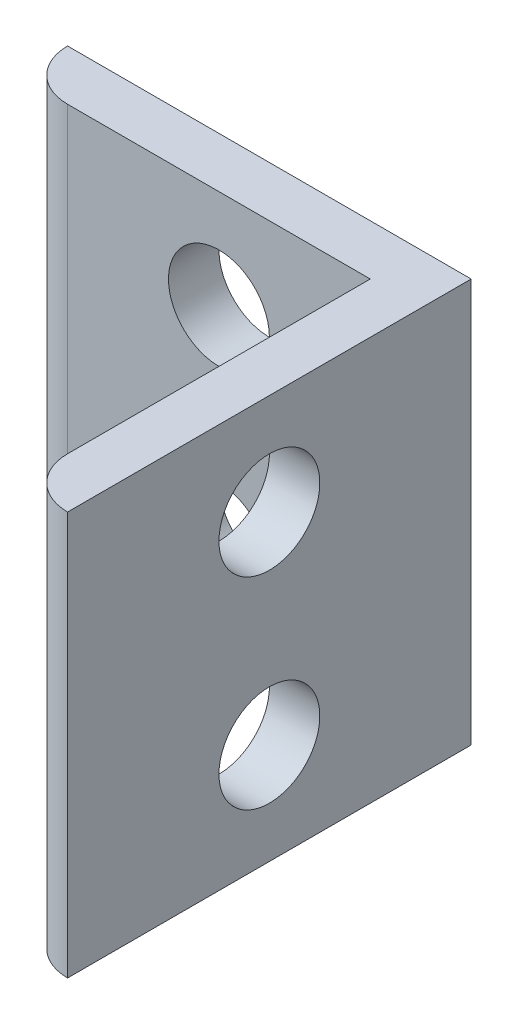
ISO-10303-21;
HEADER;
FILE_DESCRIPTION(('STEP AP214'),'2;1');
FILE_NAME('part.step','',(''),(''),'','','');
FILE_SCHEMA(('AUTOMOTIVE_DESIGN { 1 0 10303 214 1 1 1 1 }'));
ENDSEC;
DATA;
#1=APPLICATION_CONTEXT('core data for automotive mechanical design processes');
#2=APPLICATION_PROTOCOL_DEFINITION('international standard','automotive_design',2000,#1);
#3=PRODUCT_CONTEXT('',#1,'mechanical');
#4=PRODUCT('Part','Part','',(#3));
#5=PRODUCT_RELATED_PRODUCT_CATEGORY('part','',(#4));
#6=PRODUCT_DEFINITION_FORMATION('','',#4);
#7=PRODUCT_DEFINITION_CONTEXT('part definition',#1,'design');
#8=PRODUCT_DEFINITION('design','',#6,#7);
#9=PRODUCT_DEFINITION_SHAPE('','',#8);
#10=(LENGTH_UNIT() NAMED_UNIT(*) SI_UNIT(.MILLI.,.METRE.));
#11=(NAMED_UNIT(*) PLANE_ANGLE_UNIT() SI_UNIT($,.RADIAN.));
#12=(NAMED_UNIT(*) SI_UNIT($,.STERADIAN.) SOLID_ANGLE_UNIT());
#13=UNCERTAINTY_MEASURE_WITH_UNIT(LENGTH_MEASURE(1.E-05),#10,'distance_accuracy_value','');
#14=(GEOMETRIC_REPRESENTATION_CONTEXT(3) GLOBAL_UNCERTAINTY_ASSIGNED_CONTEXT((#13)) GLOBAL_UNIT_ASSIGNED_CONTEXT((#10,
#11,#12)) REPRESENTATION_CONTEXT('',''));
#15=CARTESIAN_POINT('',(0.,0.,0.));
#16=DIRECTION('',(0.,0.,1.));
#17=DIRECTION('',(1.,0.,0.));
#18=AXIS2_PLACEMENT_3D('',#15,#16,#17);
#19=CARTESIAN_POINT('',(3.175,25.4,3.175));
#20=DIRECTION('',(0.,0.,-1.));
#21=DIRECTION('',(-1.,0.,0.));
#22=AXIS2_PLACEMENT_3D('',#19,#20,#21);
#23=PLANE('',#22);
#24=CARTESIAN_POINT('',(12.7,6.35,3.175));
#25=DIRECTION('',(0.,0.,1.));
#26=DIRECTION('',(1.,0.,0.));
#27=AXIS2_PLACEMENT_3D('',#24,#25,#26);
#28=CIRCLE('',#27,3.17499999999999);
#29=CARTESIAN_POINT('',(15.875,6.35,3.175));
#30=VERTEX_POINT('',#29);
#31=EDGE_CURVE('E261',#30,#30,#28,.T.);
#32=ORIENTED_EDGE('',*,*,#31,.F.);
#33=EDGE_LOOP('',(#32));
#34=FACE_BOUND('',#33,.T.);
#35=DIRECTION('',(1.,0.,0.));
#36=VECTOR('',#35,1.);
#37=CARTESIAN_POINT('',(3.175,0.,3.175));
#38=LINE('',#37,#36);
#39=CARTESIAN_POINT('',(3.175,0.,3.175));
#40=VERTEX_POINT('',#39);
#41=CARTESIAN_POINT('',(22.225,0.,3.175));
#42=VERTEX_POINT('',#41);
#43=EDGE_CURVE('E121',#40,#42,#38,.T.);
#44=ORIENTED_EDGE('',*,*,#43,.T.);
#45=DIRECTION('',(0.,-1.,0.));
#46=VECTOR('',#45,1.);
#47=CARTESIAN_POINT('',(22.225,25.4,3.175));
#48=LINE('',#47,#46);
#49=CARTESIAN_POINT('',(22.225,25.4,3.175));
#50=VERTEX_POINT('',#49);
#51=EDGE_CURVE('E42',#50,#42,#48,.T.);
#52=ORIENTED_EDGE('',*,*,#51,.F.);
#53=DIRECTION('',(1.,0.,0.));
#54=VECTOR('',#53,1.);
#55=CARTESIAN_POINT('',(3.175,25.4,3.175));
#56=LINE('',#55,#54);
#57=CARTESIAN_POINT('',(3.175,25.4,3.175));
#58=VERTEX_POINT('',#57);
#59=EDGE_CURVE('E87',#58,#50,#56,.T.);
#60=ORIENTED_EDGE('',*,*,#59,.F.);
#61=DIRECTION('',(0.,-1.,0.));
#62=VECTOR('',#61,1.);
#63=CARTESIAN_POINT('',(3.175,25.4,3.175));
#64=LINE('',#63,#62);
#65=EDGE_CURVE('E11',#58,#40,#64,.T.);
#66=ORIENTED_EDGE('',*,*,#65,.T.);
#67=EDGE_LOOP('',(#44,#52,#60,#66));
#68=FACE_BOUND('',#67,.T.);
#69=CARTESIAN_POINT('',(12.7,19.05,3.175));
#70=DIRECTION('',(0.,0.,1.));
#71=DIRECTION('',(1.,0.,0.));
#72=AXIS2_PLACEMENT_3D('',#69,#70,#71);
#73=CIRCLE('',#72,3.17499999999999);
#74=CARTESIAN_POINT('',(15.875,19.05,3.175));
#75=VERTEX_POINT('',#74);
#76=EDGE_CURVE('E258',#75,#75,#73,.T.);
#77=ORIENTED_EDGE('',*,*,#76,.F.);
#78=EDGE_LOOP('',(#77));
#79=FACE_BOUND('',#78,.T.);
#80=ADVANCED_FACE('F33',(#34,#68,#79),#23,.F.);
#81=CARTESIAN_POINT('',(22.225,25.4,3.175));
#82=DIRECTION('',(1.,0.,0.));
#83=DIRECTION('',(0.,0.,-1.));
#84=AXIS2_PLACEMENT_3D('',#81,#82,#83);
#85=PLANE('',#84);
#86=CARTESIAN_POINT('',(22.225,6.35,12.7));
#87=DIRECTION('',(-1.,0.,0.));
#88=DIRECTION('',(0.,0.,1.));
#89=AXIS2_PLACEMENT_3D('',#86,#87,#88);
#90=CIRCLE('',#89,3.17499999999999);
#91=CARTESIAN_POINT('',(22.225,6.35,15.875));
#92=VERTEX_POINT('',#91);
#93=EDGE_CURVE('E275',#92,#92,#90,.T.);
#94=ORIENTED_EDGE('',*,*,#93,.F.);
#95=EDGE_LOOP('',(#94));
#96=FACE_BOUND('',#95,.T.);
#97=DIRECTION('',(0.,0.,1.));
#98=VECTOR('',#97,1.);
#99=CARTESIAN_POINT('',(22.225,0.,3.175));
#100=LINE('',#99,#98);
#101=CARTESIAN_POINT('',(22.225,0.,22.225));
#102=VERTEX_POINT('',#101);
#103=EDGE_CURVE('E124',#42,#102,#100,.T.);
#104=ORIENTED_EDGE('',*,*,#103,.T.);
#105=DIRECTION('',(0.,-1.,0.));
#106=VECTOR('',#105,1.);
#107=CARTESIAN_POINT('',(22.225,25.4,22.225));
#108=LINE('',#107,#106);
#109=CARTESIAN_POINT('',(22.225,25.4,22.225));
#110=VERTEX_POINT('',#109);
#111=EDGE_CURVE('E109',#110,#102,#108,.T.);
#112=ORIENTED_EDGE('',*,*,#111,.F.);
#113=DIRECTION('',(0.,0.,1.));
#114=VECTOR('',#113,1.);
#115=CARTESIAN_POINT('',(22.225,25.4,3.175));
#116=LINE('',#115,#114);
#117=EDGE_CURVE('E100',#50,#110,#116,.T.);
#118=ORIENTED_EDGE('',*,*,#117,.F.);
#119=ORIENTED_EDGE('',*,*,#51,.T.);
#120=EDGE_LOOP('',(#104,#112,#118,#119));
#121=FACE_BOUND('',#120,.T.);
#122=CARTESIAN_POINT('',(22.225,19.05,12.7));
#123=DIRECTION('',(-1.,0.,0.));
#124=DIRECTION('',(0.,0.,1.));
#125=AXIS2_PLACEMENT_3D('',#122,#123,#124);
#126=CIRCLE('',#125,3.17499999999999);
#127=CARTESIAN_POINT('',(22.225,19.05,15.875));
#128=VERTEX_POINT('',#127);
#129=EDGE_CURVE('E269',#128,#128,#126,.T.);
#130=ORIENTED_EDGE('',*,*,#129,.F.);
#131=EDGE_LOOP('',(#130));
#132=FACE_BOUND('',#131,.T.);
#133=ADVANCED_FACE('F135',(#96,#121,#132),#85,.F.);
#134=CARTESIAN_POINT('',(3.175,25.4,0.));
#135=DIRECTION('',(0.,-1.,0.));
#136=DIRECTION('',(0.,0.,-1.));
#137=AXIS2_PLACEMENT_3D('',#134,#135,#136);
#138=CYLINDRICAL_SURFACE('',#137,3.175);
#139=CARTESIAN_POINT('',(3.175,0.,0.));
#140=DIRECTION('',(0.,1.,0.));
#141=DIRECTION('',(0.,0.,1.));
#142=AXIS2_PLACEMENT_3D('',#139,#140,#141);
#143=CIRCLE('',#142,3.175);
#144=CARTESIAN_POINT('',(0.,0.,0.));
#145=VERTEX_POINT('',#144);
#146=EDGE_CURVE('E118',#145,#40,#143,.T.);
#147=ORIENTED_EDGE('',*,*,#146,.T.);
#148=ORIENTED_EDGE('',*,*,#65,.F.);
#149=CARTESIAN_POINT('',(3.175,25.4,0.));
#150=DIRECTION('',(0.,1.,0.));
#151=DIRECTION('',(0.,0.,1.));
#152=AXIS2_PLACEMENT_3D('',#149,#150,#151);
#153=CIRCLE('',#152,3.175);
#154=CARTESIAN_POINT('',(0.,25.4,0.));
#155=VERTEX_POINT('',#154);
#156=EDGE_CURVE('E129',#155,#58,#153,.T.);
#157=ORIENTED_EDGE('',*,*,#156,.F.);
#158=DIRECTION('',(0.,-1.,0.));
#159=VECTOR('',#158,1.);
#160=CARTESIAN_POINT('',(0.,25.4,0.));
#161=LINE('',#160,#159);
#162=EDGE_CURVE('E114',#155,#145,#161,.T.);
#163=ORIENTED_EDGE('',*,*,#162,.T.);
#164=EDGE_LOOP('',(#147,#148,#157,#163));
#165=FACE_BOUND('',#164,.T.);
#166=ADVANCED_FACE('F35',(#165),#138,.T.);
#167=CARTESIAN_POINT('',(25.4,25.4,22.225));
#168=DIRECTION('',(0.,-1.,0.));
#169=DIRECTION('',(0.,0.,-1.));
#170=AXIS2_PLACEMENT_3D('',#167,#168,#169);
#171=CYLINDRICAL_SURFACE('',#170,3.175);
#172=CARTESIAN_POINT('',(25.4,0.,22.225));
#173=DIRECTION('',(0.,1.,0.));
#174=DIRECTION('',(0.,0.,-1.));
#175=AXIS2_PLACEMENT_3D('',#172,#173,#174);
#176=CIRCLE('',#175,3.175);
#177=CARTESIAN_POINT('',(25.4,0.,25.4));
#178=VERTEX_POINT('',#177);
#179=EDGE_CURVE('E108',#102,#178,#176,.T.);
#180=ORIENTED_EDGE('',*,*,#179,.T.);
#181=DIRECTION('',(0.,-1.,0.));
#182=VECTOR('',#181,1.);
#183=CARTESIAN_POINT('',(25.4,25.4,25.4));
#184=LINE('',#183,#182);
#185=CARTESIAN_POINT('',(25.4,25.4,25.4));
#186=VERTEX_POINT('',#185);
#187=EDGE_CURVE('E105',#186,#178,#184,.T.);
#188=ORIENTED_EDGE('',*,*,#187,.F.);
#189=CARTESIAN_POINT('',(25.4,25.4,22.225));
#190=DIRECTION('',(0.,1.,0.));
#191=DIRECTION('',(0.,0.,-1.));
#192=AXIS2_PLACEMENT_3D('',#189,#190,#191);
#193=CIRCLE('',#192,3.175);
#194=EDGE_CURVE('E94',#110,#186,#193,.T.);
#195=ORIENTED_EDGE('',*,*,#194,.F.);
#196=ORIENTED_EDGE('',*,*,#111,.T.);
#197=EDGE_LOOP('',(#180,#188,#195,#196));
#198=FACE_BOUND('',#197,.T.);
#199=ADVANCED_FACE('F106',(#198),#171,.T.);
#200=CARTESIAN_POINT('',(25.4,25.4,0.));
#201=DIRECTION('',(-1.,0.,0.));
#202=DIRECTION('',(0.,0.,1.));
#203=AXIS2_PLACEMENT_3D('',#200,#201,#202);
#204=PLANE('',#203);
#205=CARTESIAN_POINT('',(25.4,19.05,12.7));
#206=DIRECTION('',(-1.,0.,0.));
#207=DIRECTION('',(0.,0.,1.));
#208=AXIS2_PLACEMENT_3D('',#205,#206,#207);
#209=CIRCLE('',#208,3.17499999999999);
#210=CARTESIAN_POINT('',(25.4,19.05,15.875));
#211=VERTEX_POINT('',#210);
#212=EDGE_CURVE('E272',#211,#211,#209,.T.);
#213=ORIENTED_EDGE('',*,*,#212,.T.);
#214=EDGE_LOOP('',(#213));
#215=FACE_BOUND('',#214,.T.);
#216=CARTESIAN_POINT('',(25.4,6.35,12.7));
#217=DIRECTION('',(-1.,0.,0.));
#218=DIRECTION('',(0.,0.,1.));
#219=AXIS2_PLACEMENT_3D('',#216,#217,#218);
#220=CIRCLE('',#219,3.17499999999999);
#221=CARTESIAN_POINT('',(25.4,6.35,15.875));
#222=VERTEX_POINT('',#221);
#223=EDGE_CURVE('E122',#222,#222,#220,.T.);
#224=ORIENTED_EDGE('',*,*,#223,.T.);
#225=EDGE_LOOP('',(#224));
#226=FACE_BOUND('',#225,.T.);
#227=DIRECTION('',(0.,0.,-1.));
#228=VECTOR('',#227,1.);
#229=CARTESIAN_POINT('',(25.4,0.,0.));
#230=LINE('',#229,#228);
#231=CARTESIAN_POINT('',(25.4,0.,0.));
#232=VERTEX_POINT('',#231);
#233=EDGE_CURVE('E73',#178,#232,#230,.T.);
#234=ORIENTED_EDGE('',*,*,#233,.T.);
#235=DIRECTION('',(0.,-1.,0.));
#236=VECTOR('',#235,1.);
#237=CARTESIAN_POINT('',(25.4,25.4,0.));
#238=LINE('',#237,#236);
#239=CARTESIAN_POINT('',(25.4,25.4,0.));
#240=VERTEX_POINT('',#239);
#241=EDGE_CURVE('E110',#240,#232,#238,.T.);
#242=ORIENTED_EDGE('',*,*,#241,.F.);
#243=DIRECTION('',(0.,0.,-1.));
#244=VECTOR('',#243,1.);
#245=CARTESIAN_POINT('',(25.4,25.4,0.));
#246=LINE('',#245,#244);
#247=EDGE_CURVE('E98',#186,#240,#246,.T.);
#248=ORIENTED_EDGE('',*,*,#247,.F.);
#249=ORIENTED_EDGE('',*,*,#187,.T.);
#250=EDGE_LOOP('',(#234,#242,#248,#249));
#251=FACE_BOUND('',#250,.T.);
#252=ADVANCED_FACE('F112',(#215,#226,#251),#204,.F.);
#253=CARTESIAN_POINT('',(0.,25.4,0.));
#254=DIRECTION('',(0.,0.,1.));
#255=DIRECTION('',(1.,0.,0.));
#256=AXIS2_PLACEMENT_3D('',#253,#254,#255);
#257=PLANE('',#256);
#258=CARTESIAN_POINT('',(12.7,19.05,0.));
#259=DIRECTION('',(0.,0.,1.));
#260=DIRECTION('',(1.,0.,0.));
#261=AXIS2_PLACEMENT_3D('',#258,#259,#260);
#262=CIRCLE('',#261,3.17499999999999);
#263=CARTESIAN_POINT('',(15.875,19.05,0.));
#264=VERTEX_POINT('',#263);
#265=EDGE_CURVE('E255',#264,#264,#262,.T.);
#266=ORIENTED_EDGE('',*,*,#265,.T.);
#267=EDGE_LOOP('',(#266));
#268=FACE_BOUND('',#267,.T.);
#269=CARTESIAN_POINT('',(12.7,6.35,0.));
#270=DIRECTION('',(0.,0.,1.));
#271=DIRECTION('',(1.,0.,0.));
#272=AXIS2_PLACEMENT_3D('',#269,#270,#271);
#273=CIRCLE('',#272,3.17499999999999);
#274=CARTESIAN_POINT('',(15.875,6.35,0.));
#275=VERTEX_POINT('',#274);
#276=EDGE_CURVE('E266',#275,#275,#273,.T.);
#277=ORIENTED_EDGE('',*,*,#276,.T.);
#278=EDGE_LOOP('',(#277));
#279=FACE_BOUND('',#278,.T.);
#280=DIRECTION('',(-1.,0.,0.));
#281=VECTOR('',#280,1.);
#282=CARTESIAN_POINT('',(0.,0.,0.));
#283=LINE('',#282,#281);
#284=EDGE_CURVE('E79',#232,#145,#283,.T.);
#285=ORIENTED_EDGE('',*,*,#284,.T.);
#286=ORIENTED_EDGE('',*,*,#162,.F.);
#287=DIRECTION('',(-1.,0.,0.));
#288=VECTOR('',#287,1.);
#289=CARTESIAN_POINT('',(0.,25.4,0.));
#290=LINE('',#289,#288);
#291=EDGE_CURVE('E50',#240,#155,#290,.T.);
#292=ORIENTED_EDGE('',*,*,#291,.F.);
#293=ORIENTED_EDGE('',*,*,#241,.T.);
#294=EDGE_LOOP('',(#285,#286,#292,#293));
#295=FACE_BOUND('',#294,.T.);
#296=ADVANCED_FACE('F143',(#268,#279,#295),#257,.F.);
#297=CARTESIAN_POINT('',(3.175,25.4,0.));
#298=DIRECTION('',(0.,1.,0.));
#299=DIRECTION('',(0.,0.,1.));
#300=AXIS2_PLACEMENT_3D('',#297,#298,#299);
#301=PLANE('',#300);
#302=ORIENTED_EDGE('',*,*,#156,.T.);
#303=ORIENTED_EDGE('',*,*,#59,.T.);
#304=ORIENTED_EDGE('',*,*,#117,.T.);
#305=ORIENTED_EDGE('',*,*,#194,.T.);
#306=ORIENTED_EDGE('',*,*,#247,.T.);
#307=ORIENTED_EDGE('',*,*,#291,.T.);
#308=EDGE_LOOP('',(#302,#303,#304,#305,#306,#307));
#309=FACE_BOUND('',#308,.T.);
#310=ADVANCED_FACE('F96',(#309),#301,.T.);
#311=CARTESIAN_POINT('',(3.175,0.,0.));
#312=DIRECTION('',(0.,1.,0.));
#313=DIRECTION('',(0.,0.,1.));
#314=AXIS2_PLACEMENT_3D('',#311,#312,#313);
#315=PLANE('',#314);
#316=ORIENTED_EDGE('',*,*,#146,.F.);
#317=ORIENTED_EDGE('',*,*,#284,.F.);
#318=ORIENTED_EDGE('',*,*,#233,.F.);
#319=ORIENTED_EDGE('',*,*,#179,.F.);
#320=ORIENTED_EDGE('',*,*,#103,.F.);
#321=ORIENTED_EDGE('',*,*,#43,.F.);
#322=EDGE_LOOP('',(#316,#317,#318,#319,#320,#321));
#323=FACE_BOUND('',#322,.T.);
#324=ADVANCED_FACE('F139',(#323),#315,.F.);
#325=CARTESIAN_POINT('',(22.225,6.35,12.7));
#326=DIRECTION('',(-1.,0.,0.));
#327=DIRECTION('',(0.,0.,1.));
#328=AXIS2_PLACEMENT_3D('',#325,#326,#327);
#329=CYLINDRICAL_SURFACE('',#328,3.17499999999999);
#330=ORIENTED_EDGE('',*,*,#223,.F.);
#331=EDGE_LOOP('',(#330));
#332=FACE_BOUND('',#331,.T.);
#333=ORIENTED_EDGE('',*,*,#93,.T.);
#334=EDGE_LOOP('',(#333));
#335=FACE_BOUND('',#334,.T.);
#336=ADVANCED_FACE('F195',(#332,#335),#329,.F.);
#337=CARTESIAN_POINT('',(22.225,19.05,12.7));
#338=DIRECTION('',(-1.,0.,0.));
#339=DIRECTION('',(0.,0.,1.));
#340=AXIS2_PLACEMENT_3D('',#337,#338,#339);
#341=CYLINDRICAL_SURFACE('',#340,3.17499999999999);
#342=ORIENTED_EDGE('',*,*,#212,.F.);
#343=EDGE_LOOP('',(#342));
#344=FACE_BOUND('',#343,.T.);
#345=ORIENTED_EDGE('',*,*,#129,.T.);
#346=EDGE_LOOP('',(#345));
#347=FACE_BOUND('',#346,.T.);
#348=ADVANCED_FACE('F199',(#344,#347),#341,.F.);
#349=CARTESIAN_POINT('',(12.7,6.35,3.175));
#350=DIRECTION('',(0.,0.,1.));
#351=DIRECTION('',(1.,0.,0.));
#352=AXIS2_PLACEMENT_3D('',#349,#350,#351);
#353=CYLINDRICAL_SURFACE('',#352,3.17499999999999);
#354=ORIENTED_EDGE('',*,*,#276,.F.);
#355=EDGE_LOOP('',(#354));
#356=FACE_BOUND('',#355,.T.);
#357=ORIENTED_EDGE('',*,*,#31,.T.);
#358=EDGE_LOOP('',(#357));
#359=FACE_BOUND('',#358,.T.);
#360=ADVANCED_FACE('F208',(#356,#359),#353,.F.);
#361=CARTESIAN_POINT('',(12.7,19.05,3.175));
#362=DIRECTION('',(0.,0.,1.));
#363=DIRECTION('',(1.,0.,0.));
#364=AXIS2_PLACEMENT_3D('',#361,#362,#363);
#365=CYLINDRICAL_SURFACE('',#364,3.17499999999999);
#366=ORIENTED_EDGE('',*,*,#265,.F.);
#367=EDGE_LOOP('',(#366));
#368=FACE_BOUND('',#367,.T.);
#369=ORIENTED_EDGE('',*,*,#76,.T.);
#370=EDGE_LOOP('',(#369));
#371=FACE_BOUND('',#370,.T.);
#372=ADVANCED_FACE('F227',(#368,#371),#365,.F.);
#373=CLOSED_SHELL('',(#80,#133,#166,#199,#252,#296,#310,#324,#336,#348,#360,#372));
#374=MANIFOLD_SOLID_BREP('B2',#373);
#375=ADVANCED_BREP_SHAPE_REPRESENTATION('',(#18,#374),#14);
#376=SHAPE_DEFINITION_REPRESENTATION(#9,#375);
ENDSEC;
END-ISO-10303-21;
